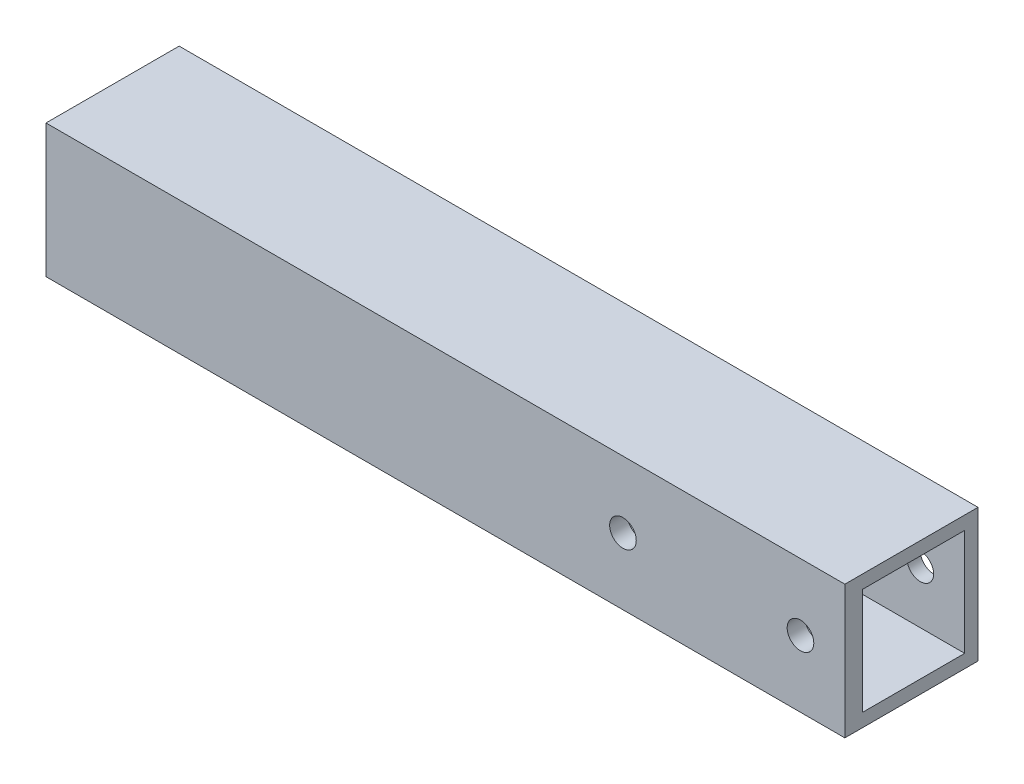
ISO-10303-21;
HEADER;
FILE_DESCRIPTION(('STEP AP214'),'2;1');
FILE_NAME('part.step','',(''),(''),'','','');
FILE_SCHEMA(('AUTOMOTIVE_DESIGN { 1 0 10303 214 1 1 1 1 }'));
ENDSEC;
DATA;
#1=APPLICATION_CONTEXT('core data for automotive mechanical design processes');
#2=APPLICATION_PROTOCOL_DEFINITION('international standard','automotive_design',2000,#1);
#3=PRODUCT_CONTEXT('',#1,'mechanical');
#4=PRODUCT('Part','Part','',(#3));
#5=PRODUCT_RELATED_PRODUCT_CATEGORY('part','',(#4));
#6=PRODUCT_DEFINITION_FORMATION('','',#4);
#7=PRODUCT_DEFINITION_CONTEXT('part definition',#1,'design');
#8=PRODUCT_DEFINITION('design','',#6,#7);
#9=PRODUCT_DEFINITION_SHAPE('','',#8);
#10=(LENGTH_UNIT() NAMED_UNIT(*) SI_UNIT(.MILLI.,.METRE.));
#11=(NAMED_UNIT(*) PLANE_ANGLE_UNIT() SI_UNIT($,.RADIAN.));
#12=(NAMED_UNIT(*) SI_UNIT($,.STERADIAN.) SOLID_ANGLE_UNIT());
#13=UNCERTAINTY_MEASURE_WITH_UNIT(LENGTH_MEASURE(1.E-05),#10,'distance_accuracy_value','');
#14=(GEOMETRIC_REPRESENTATION_CONTEXT(3) GLOBAL_UNCERTAINTY_ASSIGNED_CONTEXT((#13)) GLOBAL_UNIT_ASSIGNED_CONTEXT((#10,
#11,#12)) REPRESENTATION_CONTEXT('',''));
#15=CARTESIAN_POINT('',(0.,0.,0.));
#16=DIRECTION('',(0.,0.,1.));
#17=DIRECTION('',(1.,0.,0.));
#18=AXIS2_PLACEMENT_3D('',#15,#16,#17);
#19=CARTESIAN_POINT('',(90.,5.99999999999999,-3.50000000000001));
#20=DIRECTION('',(0.,-1.,0.));
#21=DIRECTION('',(0.,0.,-1.));
#22=AXIS2_PLACEMENT_3D('',#19,#20,#21);
#23=PLANE('',#22);
#24=DIRECTION('',(0.,0.,1.));
#25=VECTOR('',#24,1.);
#26=CARTESIAN_POINT('',(0.,5.99999999999999,-3.50000000000001));
#27=LINE('',#26,#25);
#28=CARTESIAN_POINT('',(0.,5.99999999999999,-6.));
#29=VERTEX_POINT('',#28);
#30=CARTESIAN_POINT('',(0.,5.99999999999999,5.50000000000001));
#31=VERTEX_POINT('',#30);
#32=EDGE_CURVE('E131',#29,#31,#27,.T.);
#33=ORIENTED_EDGE('',*,*,#32,.F.);
#34=DIRECTION('',(-1.,0.,0.));
#35=VECTOR('',#34,1.);
#36=CARTESIAN_POINT('',(90.,5.99999999999999,-6.));
#37=LINE('',#36,#35);
#38=CARTESIAN_POINT('',(90.,5.99999999999999,-6.));
#39=VERTEX_POINT('',#38);
#40=EDGE_CURVE('E12',#39,#29,#37,.T.);
#41=ORIENTED_EDGE('',*,*,#40,.F.);
#42=DIRECTION('',(0.,0.,1.));
#43=VECTOR('',#42,1.);
#44=CARTESIAN_POINT('',(90.,5.99999999999999,5.50000000000001));
#45=LINE('',#44,#43);
#46=CARTESIAN_POINT('',(90.,5.99999999999999,5.50000000000001));
#47=VERTEX_POINT('',#46);
#48=EDGE_CURVE('E160',#39,#47,#45,.T.);
#49=ORIENTED_EDGE('',*,*,#48,.T.);
#50=DIRECTION('',(-1.,0.,0.));
#51=VECTOR('',#50,1.);
#52=CARTESIAN_POINT('',(90.,5.99999999999999,5.50000000000001));
#53=LINE('',#52,#51);
#54=EDGE_CURVE('E209',#47,#31,#53,.T.);
#55=ORIENTED_EDGE('',*,*,#54,.T.);
#56=EDGE_LOOP('',(#33,#41,#49,#55));
#57=FACE_BOUND('',#56,.T.);
#58=ADVANCED_FACE('F79',(#57),#23,.T.);
#59=CARTESIAN_POINT('',(90.,-6.00000000000001,-6.));
#60=DIRECTION('',(0.,0.,1.));
#61=DIRECTION('',(0.,-1.,0.));
#62=AXIS2_PLACEMENT_3D('',#59,#60,#61);
#63=PLANE('',#62);
#64=CARTESIAN_POINT('',(85.,0.,-6.00000000000001));
#65=DIRECTION('',(0.,0.,1.));
#66=DIRECTION('',(0.,-1.,0.));
#67=AXIS2_PLACEMENT_3D('',#64,#65,#66);
#68=CIRCLE('',#67,1.5);
#69=CARTESIAN_POINT('',(86.5,0.,-6.00000000000001));
#70=VERTEX_POINT('',#69);
#71=EDGE_CURVE('E187',#70,#70,#68,.T.);
#72=ORIENTED_EDGE('',*,*,#71,.F.);
#73=EDGE_LOOP('',(#72));
#74=FACE_BOUND('',#73,.T.);
#75=CARTESIAN_POINT('',(65.,0.,-6.00000000000001));
#76=DIRECTION('',(0.,0.,1.));
#77=DIRECTION('',(0.,-1.,0.));
#78=AXIS2_PLACEMENT_3D('',#75,#76,#77);
#79=CIRCLE('',#78,1.5);
#80=CARTESIAN_POINT('',(66.5,0.,-6.00000000000001));
#81=VERTEX_POINT('',#80);
#82=EDGE_CURVE('E230',#81,#81,#79,.T.);
#83=ORIENTED_EDGE('',*,*,#82,.F.);
#84=EDGE_LOOP('',(#83));
#85=FACE_BOUND('',#84,.T.);
#86=DIRECTION('',(0.,1.,0.));
#87=VECTOR('',#86,1.);
#88=CARTESIAN_POINT('',(0.,-6.00000000000001,-6.));
#89=LINE('',#88,#87);
#90=CARTESIAN_POINT('',(0.,-6.00000000000001,-6.));
#91=VERTEX_POINT('',#90);
#92=EDGE_CURVE('E168',#91,#29,#89,.T.);
#93=ORIENTED_EDGE('',*,*,#92,.F.);
#94=DIRECTION('',(-1.,0.,0.));
#95=VECTOR('',#94,1.);
#96=CARTESIAN_POINT('',(90.,-6.00000000000001,-6.));
#97=LINE('',#96,#95);
#98=CARTESIAN_POINT('',(90.,-6.00000000000001,-6.));
#99=VERTEX_POINT('',#98);
#100=EDGE_CURVE('E90',#99,#91,#97,.T.);
#101=ORIENTED_EDGE('',*,*,#100,.F.);
#102=DIRECTION('',(0.,1.,0.));
#103=VECTOR('',#102,1.);
#104=CARTESIAN_POINT('',(90.,5.99999999999999,-6.));
#105=LINE('',#104,#103);
#106=EDGE_CURVE('E153',#99,#39,#105,.T.);
#107=ORIENTED_EDGE('',*,*,#106,.T.);
#108=ORIENTED_EDGE('',*,*,#40,.T.);
#109=EDGE_LOOP('',(#93,#101,#107,#108));
#110=FACE_BOUND('',#109,.T.);
#111=ADVANCED_FACE('F167',(#74,#85,#110),#63,.T.);
#112=CARTESIAN_POINT('',(90.,-6.00000000000001,5.50000000000001));
#113=DIRECTION('',(0.,1.,0.));
#114=DIRECTION('',(0.,0.,1.));
#115=AXIS2_PLACEMENT_3D('',#112,#113,#114);
#116=PLANE('',#115);
#117=DIRECTION('',(0.,0.,-1.));
#118=VECTOR('',#117,1.);
#119=CARTESIAN_POINT('',(0.,-6.00000000000001,5.50000000000001));
#120=LINE('',#119,#118);
#121=CARTESIAN_POINT('',(0.,-6.00000000000001,5.50000000000001));
#122=VERTEX_POINT('',#121);
#123=EDGE_CURVE('E203',#122,#91,#120,.T.);
#124=ORIENTED_EDGE('',*,*,#123,.F.);
#125=DIRECTION('',(-1.,0.,0.));
#126=VECTOR('',#125,1.);
#127=CARTESIAN_POINT('',(90.,-6.00000000000001,5.50000000000001));
#128=LINE('',#127,#126);
#129=CARTESIAN_POINT('',(90.,-6.00000000000001,5.50000000000001));
#130=VERTEX_POINT('',#129);
#131=EDGE_CURVE('E172',#130,#122,#128,.T.);
#132=ORIENTED_EDGE('',*,*,#131,.F.);
#133=DIRECTION('',(0.,0.,-1.));
#134=VECTOR('',#133,1.);
#135=CARTESIAN_POINT('',(90.,-6.,-4.00000000000001));
#136=LINE('',#135,#134);
#137=EDGE_CURVE('E157',#130,#99,#136,.T.);
#138=ORIENTED_EDGE('',*,*,#137,.T.);
#139=ORIENTED_EDGE('',*,*,#100,.T.);
#140=EDGE_LOOP('',(#124,#132,#138,#139));
#141=FACE_BOUND('',#140,.T.);
#142=ADVANCED_FACE('F174',(#141),#116,.T.);
#143=CARTESIAN_POINT('',(90.,7.49999999999999,7.50000000000001));
#144=DIRECTION('',(0.,-1.,0.));
#145=DIRECTION('',(0.,0.,-1.));
#146=AXIS2_PLACEMENT_3D('',#143,#144,#145);
#147=PLANE('',#146);
#148=DIRECTION('',(0.,0.,1.));
#149=VECTOR('',#148,1.);
#150=CARTESIAN_POINT('',(0.,7.49999999999999,7.50000000000001));
#151=LINE('',#150,#149);
#152=CARTESIAN_POINT('',(0.,7.49999999999999,-7.5));
#153=VERTEX_POINT('',#152);
#154=CARTESIAN_POINT('',(0.,7.49999999999999,7.50000000000001));
#155=VERTEX_POINT('',#154);
#156=EDGE_CURVE('E182',#153,#155,#151,.T.);
#157=ORIENTED_EDGE('',*,*,#156,.T.);
#158=DIRECTION('',(-1.,0.,0.));
#159=VECTOR('',#158,1.);
#160=CARTESIAN_POINT('',(90.,7.49999999999999,7.50000000000001));
#161=LINE('',#160,#159);
#162=CARTESIAN_POINT('',(90.,7.49999999999999,7.50000000000001));
#163=VERTEX_POINT('',#162);
#164=EDGE_CURVE('E222',#163,#155,#161,.T.);
#165=ORIENTED_EDGE('',*,*,#164,.F.);
#166=DIRECTION('',(0.,0.,1.));
#167=VECTOR('',#166,1.);
#168=CARTESIAN_POINT('',(90.,7.49999999999999,-6.));
#169=LINE('',#168,#167);
#170=CARTESIAN_POINT('',(90.,7.49999999999999,-7.5));
#171=VERTEX_POINT('',#170);
#172=EDGE_CURVE('E140',#171,#163,#169,.T.);
#173=ORIENTED_EDGE('',*,*,#172,.F.);
#174=DIRECTION('',(-1.,0.,0.));
#175=VECTOR('',#174,1.);
#176=CARTESIAN_POINT('',(90.,7.49999999999999,-7.5));
#177=LINE('',#176,#175);
#178=EDGE_CURVE('E212',#171,#153,#177,.T.);
#179=ORIENTED_EDGE('',*,*,#178,.T.);
#180=EDGE_LOOP('',(#157,#165,#173,#179));
#181=FACE_BOUND('',#180,.T.);
#182=ADVANCED_FACE('F81',(#181),#147,.F.);
#183=CARTESIAN_POINT('',(90.,-6.00000000000001,7.50000000000001));
#184=DIRECTION('',(0.,0.,-1.));
#185=DIRECTION('',(-1.,0.,0.));
#186=AXIS2_PLACEMENT_3D('',#183,#184,#185);
#187=PLANE('',#186);
#188=CARTESIAN_POINT('',(85.,0.,7.50000000000001));
#189=DIRECTION('',(0.,0.,1.));
#190=DIRECTION('',(1.,0.,0.));
#191=AXIS2_PLACEMENT_3D('',#188,#189,#190);
#192=CIRCLE('',#191,1.5);
#193=CARTESIAN_POINT('',(86.5,0.,7.50000000000001));
#194=VERTEX_POINT('',#193);
#195=EDGE_CURVE('E239',#194,#194,#192,.T.);
#196=ORIENTED_EDGE('',*,*,#195,.F.);
#197=EDGE_LOOP('',(#196));
#198=FACE_BOUND('',#197,.T.);
#199=CARTESIAN_POINT('',(65.,0.,7.50000000000001));
#200=DIRECTION('',(0.,0.,1.));
#201=DIRECTION('',(1.,0.,0.));
#202=AXIS2_PLACEMENT_3D('',#199,#200,#201);
#203=CIRCLE('',#202,1.5);
#204=CARTESIAN_POINT('',(66.5,0.,7.50000000000001));
#205=VERTEX_POINT('',#204);
#206=EDGE_CURVE('E251',#205,#205,#203,.T.);
#207=ORIENTED_EDGE('',*,*,#206,.F.);
#208=EDGE_LOOP('',(#207));
#209=FACE_BOUND('',#208,.T.);
#210=DIRECTION('',(0.,-1.,0.));
#211=VECTOR('',#210,1.);
#212=CARTESIAN_POINT('',(0.,-6.00000000000001,7.50000000000001));
#213=LINE('',#212,#211);
#214=CARTESIAN_POINT('',(0.,-7.50000000000001,7.50000000000001));
#215=VERTEX_POINT('',#214);
#216=EDGE_CURVE('E186',#155,#215,#213,.T.);
#217=ORIENTED_EDGE('',*,*,#216,.T.);
#218=DIRECTION('',(-1.,0.,0.));
#219=VECTOR('',#218,1.);
#220=CARTESIAN_POINT('',(90.,-7.50000000000001,7.50000000000001));
#221=LINE('',#220,#219);
#222=CARTESIAN_POINT('',(90.,-7.50000000000001,7.50000000000001));
#223=VERTEX_POINT('',#222);
#224=EDGE_CURVE('E218',#223,#215,#221,.T.);
#225=ORIENTED_EDGE('',*,*,#224,.F.);
#226=DIRECTION('',(0.,-1.,0.));
#227=VECTOR('',#226,1.);
#228=CARTESIAN_POINT('',(90.,6.00000000000001,7.50000000000001));
#229=LINE('',#228,#227);
#230=EDGE_CURVE('E262',#163,#223,#229,.T.);
#231=ORIENTED_EDGE('',*,*,#230,.F.);
#232=ORIENTED_EDGE('',*,*,#164,.T.);
#233=EDGE_LOOP('',(#217,#225,#231,#232));
#234=FACE_BOUND('',#233,.T.);
#235=ADVANCED_FACE('F300',(#198,#209,#234),#187,.F.);
#236=CARTESIAN_POINT('',(90.,-7.5,-7.5));
#237=DIRECTION('',(0.,1.,0.));
#238=DIRECTION('',(0.,0.,1.));
#239=AXIS2_PLACEMENT_3D('',#236,#237,#238);
#240=PLANE('',#239);
#241=DIRECTION('',(0.,0.,-1.));
#242=VECTOR('',#241,1.);
#243=CARTESIAN_POINT('',(0.,-7.5,-7.5));
#244=LINE('',#243,#242);
#245=CARTESIAN_POINT('',(0.,-7.5,-7.5));
#246=VERTEX_POINT('',#245);
#247=EDGE_CURVE('E191',#215,#246,#244,.T.);
#248=ORIENTED_EDGE('',*,*,#247,.T.);
#249=DIRECTION('',(-1.,0.,0.));
#250=VECTOR('',#249,1.);
#251=CARTESIAN_POINT('',(90.,-7.5,-7.5));
#252=LINE('',#251,#250);
#253=CARTESIAN_POINT('',(90.,-7.5,-7.5));
#254=VERTEX_POINT('',#253);
#255=EDGE_CURVE('E178',#254,#246,#252,.T.);
#256=ORIENTED_EDGE('',*,*,#255,.F.);
#257=DIRECTION('',(0.,0.,-1.));
#258=VECTOR('',#257,1.);
#259=CARTESIAN_POINT('',(90.,-7.50000000000001,7.50000000000001));
#260=LINE('',#259,#258);
#261=EDGE_CURVE('E265',#223,#254,#260,.T.);
#262=ORIENTED_EDGE('',*,*,#261,.F.);
#263=ORIENTED_EDGE('',*,*,#224,.T.);
#264=EDGE_LOOP('',(#248,#256,#262,#263));
#265=FACE_BOUND('',#264,.T.);
#266=ADVANCED_FACE('F298',(#265),#240,.F.);
#267=CARTESIAN_POINT('',(90.,6.,-7.50000000000001));
#268=DIRECTION('',(0.,0.,1.));
#269=DIRECTION('',(0.,-1.,0.));
#270=AXIS2_PLACEMENT_3D('',#267,#268,#269);
#271=PLANE('',#270);
#272=CARTESIAN_POINT('',(85.,0.,-7.50000000000001));
#273=DIRECTION('',(0.,0.,1.));
#274=DIRECTION('',(1.,0.,0.));
#275=AXIS2_PLACEMENT_3D('',#272,#273,#274);
#276=CIRCLE('',#275,1.5);
#277=CARTESIAN_POINT('',(86.5,0.,-7.50000000000001));
#278=VERTEX_POINT('',#277);
#279=EDGE_CURVE('E231',#278,#278,#276,.T.);
#280=ORIENTED_EDGE('',*,*,#279,.T.);
#281=EDGE_LOOP('',(#280));
#282=FACE_BOUND('',#281,.T.);
#283=CARTESIAN_POINT('',(65.,0.,-7.50000000000001));
#284=DIRECTION('',(0.,0.,1.));
#285=DIRECTION('',(1.,0.,0.));
#286=AXIS2_PLACEMENT_3D('',#283,#284,#285);
#287=CIRCLE('',#286,1.5);
#288=CARTESIAN_POINT('',(66.5,0.,-7.50000000000001));
#289=VERTEX_POINT('',#288);
#290=EDGE_CURVE('E245',#289,#289,#287,.T.);
#291=ORIENTED_EDGE('',*,*,#290,.T.);
#292=EDGE_LOOP('',(#291));
#293=FACE_BOUND('',#292,.T.);
#294=DIRECTION('',(0.,1.,0.));
#295=VECTOR('',#294,1.);
#296=CARTESIAN_POINT('',(0.,6.,-7.50000000000001));
#297=LINE('',#296,#295);
#298=EDGE_CURVE('E195',#246,#153,#297,.T.);
#299=ORIENTED_EDGE('',*,*,#298,.T.);
#300=ORIENTED_EDGE('',*,*,#178,.F.);
#301=DIRECTION('',(0.,1.,0.));
#302=VECTOR('',#301,1.);
#303=CARTESIAN_POINT('',(90.,7.49999999999999,-7.5));
#304=LINE('',#303,#302);
#305=EDGE_CURVE('E208',#254,#171,#304,.T.);
#306=ORIENTED_EDGE('',*,*,#305,.F.);
#307=ORIENTED_EDGE('',*,*,#255,.T.);
#308=EDGE_LOOP('',(#299,#300,#306,#307));
#309=FACE_BOUND('',#308,.T.);
#310=ADVANCED_FACE('F295',(#282,#293,#309),#271,.F.);
#311=CARTESIAN_POINT('',(90.,3.5,5.50000000000001));
#312=DIRECTION('',(0.,0.,-1.));
#313=DIRECTION('',(0.,1.,0.));
#314=AXIS2_PLACEMENT_3D('',#311,#312,#313);
#315=PLANE('',#314);
#316=CARTESIAN_POINT('',(85.,0.,5.5));
#317=DIRECTION('',(0.,0.,-1.));
#318=DIRECTION('',(0.,1.,0.));
#319=AXIS2_PLACEMENT_3D('',#316,#317,#318);
#320=CIRCLE('',#319,1.5);
#321=CARTESIAN_POINT('',(86.5,0.,5.5));
#322=VERTEX_POINT('',#321);
#323=EDGE_CURVE('E83',#322,#322,#320,.T.);
#324=ORIENTED_EDGE('',*,*,#323,.F.);
#325=EDGE_LOOP('',(#324));
#326=FACE_BOUND('',#325,.T.);
#327=CARTESIAN_POINT('',(65.,0.,5.5));
#328=DIRECTION('',(0.,0.,-1.));
#329=DIRECTION('',(0.,1.,0.));
#330=AXIS2_PLACEMENT_3D('',#327,#328,#329);
#331=CIRCLE('',#330,1.5);
#332=CARTESIAN_POINT('',(66.5,0.,5.5));
#333=VERTEX_POINT('',#332);
#334=EDGE_CURVE('E227',#333,#333,#331,.T.);
#335=ORIENTED_EDGE('',*,*,#334,.F.);
#336=EDGE_LOOP('',(#335));
#337=FACE_BOUND('',#336,.T.);
#338=DIRECTION('',(0.,-1.,0.));
#339=VECTOR('',#338,1.);
#340=CARTESIAN_POINT('',(0.,3.5,5.50000000000001));
#341=LINE('',#340,#339);
#342=EDGE_CURVE('E127',#31,#122,#341,.T.);
#343=ORIENTED_EDGE('',*,*,#342,.F.);
#344=ORIENTED_EDGE('',*,*,#54,.F.);
#345=DIRECTION('',(0.,-1.,0.));
#346=VECTOR('',#345,1.);
#347=CARTESIAN_POINT('',(90.,-3.5,5.50000000000001));
#348=LINE('',#347,#346);
#349=EDGE_CURVE('E99',#47,#130,#348,.T.);
#350=ORIENTED_EDGE('',*,*,#349,.T.);
#351=ORIENTED_EDGE('',*,*,#131,.T.);
#352=EDGE_LOOP('',(#343,#344,#350,#351));
#353=FACE_BOUND('',#352,.T.);
#354=ADVANCED_FACE('F270',(#326,#337,#353),#315,.T.);
#355=CARTESIAN_POINT('',(90.,0.,0.));
#356=DIRECTION('',(-1.,0.,0.));
#357=DIRECTION('',(0.,0.,1.));
#358=AXIS2_PLACEMENT_3D('',#355,#356,#357);
#359=PLANE('',#358);
#360=ORIENTED_EDGE('',*,*,#305,.T.);
#361=ORIENTED_EDGE('',*,*,#172,.T.);
#362=ORIENTED_EDGE('',*,*,#230,.T.);
#363=ORIENTED_EDGE('',*,*,#261,.T.);
#364=EDGE_LOOP('',(#360,#361,#362,#363));
#365=FACE_BOUND('',#364,.T.);
#366=ORIENTED_EDGE('',*,*,#48,.F.);
#367=ORIENTED_EDGE('',*,*,#106,.F.);
#368=ORIENTED_EDGE('',*,*,#137,.F.);
#369=ORIENTED_EDGE('',*,*,#349,.F.);
#370=EDGE_LOOP('',(#366,#367,#368,#369));
#371=FACE_BOUND('',#370,.T.);
#372=ADVANCED_FACE('F155',(#365,#371),#359,.F.);
#373=CARTESIAN_POINT('',(0.,0.,0.));
#374=DIRECTION('',(-1.,0.,0.));
#375=DIRECTION('',(0.,0.,1.));
#376=AXIS2_PLACEMENT_3D('',#373,#374,#375);
#377=PLANE('',#376);
#378=ORIENTED_EDGE('',*,*,#156,.F.);
#379=ORIENTED_EDGE('',*,*,#298,.F.);
#380=ORIENTED_EDGE('',*,*,#247,.F.);
#381=ORIENTED_EDGE('',*,*,#216,.F.);
#382=EDGE_LOOP('',(#378,#379,#380,#381));
#383=FACE_BOUND('',#382,.T.);
#384=ORIENTED_EDGE('',*,*,#32,.T.);
#385=ORIENTED_EDGE('',*,*,#342,.T.);
#386=ORIENTED_EDGE('',*,*,#123,.T.);
#387=ORIENTED_EDGE('',*,*,#92,.T.);
#388=EDGE_LOOP('',(#384,#385,#386,#387));
#389=FACE_BOUND('',#388,.T.);
#390=ADVANCED_FACE('F271',(#383,#389),#377,.T.);
#391=CARTESIAN_POINT('',(65.,0.,-7.50000000000001));
#392=DIRECTION('',(0.,0.,1.));
#393=DIRECTION('',(1.,0.,0.));
#394=AXIS2_PLACEMENT_3D('',#391,#392,#393);
#395=CYLINDRICAL_SURFACE('',#394,1.5);
#396=CARTESIAN_POINT('',(66.5,0.,5.5));
#397=CARTESIAN_POINT('',(66.5,0.,5.52083333333334));
#398=CARTESIAN_POINT('',(66.5,0.,5.54166666666667));
#399=CARTESIAN_POINT('',(66.5,0.,5.58333333333334));
#400=CARTESIAN_POINT('',(66.5,0.,5.60416666666667));
#401=CARTESIAN_POINT('',(66.5,0.,5.64583333333334));
#402=CARTESIAN_POINT('',(66.5,0.,5.66666666666667));
#403=CARTESIAN_POINT('',(66.5,0.,5.70833333333334));
#404=CARTESIAN_POINT('',(66.5,0.,5.72916666666667));
#405=CARTESIAN_POINT('',(66.5,0.,5.77083333333334));
#406=CARTESIAN_POINT('',(66.5,0.,5.79166666666667));
#407=CARTESIAN_POINT('',(66.5,0.,5.83333333333334));
#408=CARTESIAN_POINT('',(66.5,0.,5.85416666666667));
#409=CARTESIAN_POINT('',(66.5,0.,5.89583333333334));
#410=CARTESIAN_POINT('',(66.5,0.,5.91666666666667));
#411=CARTESIAN_POINT('',(66.5,0.,5.95833333333334));
#412=CARTESIAN_POINT('',(66.5,0.,5.97916666666667));
#413=CARTESIAN_POINT('',(66.5,0.,6.02083333333334));
#414=CARTESIAN_POINT('',(66.5,0.,6.04166666666667));
#415=CARTESIAN_POINT('',(66.5,0.,6.08333333333334));
#416=CARTESIAN_POINT('',(66.5,0.,6.10416666666667));
#417=CARTESIAN_POINT('',(66.5,0.,6.14583333333334));
#418=CARTESIAN_POINT('',(66.5,0.,6.16666666666667));
#419=CARTESIAN_POINT('',(66.5,0.,6.20833333333334));
#420=CARTESIAN_POINT('',(66.5,0.,6.22916666666667));
#421=CARTESIAN_POINT('',(66.5,0.,6.27083333333334));
#422=CARTESIAN_POINT('',(66.5,0.,6.29166666666667));
#423=CARTESIAN_POINT('',(66.5,0.,6.33333333333334));
#424=CARTESIAN_POINT('',(66.5,0.,6.35416666666667));
#425=CARTESIAN_POINT('',(66.5,0.,6.39583333333334));
#426=CARTESIAN_POINT('',(66.5,0.,6.41666666666667));
#427=CARTESIAN_POINT('',(66.5,0.,6.45833333333334));
#428=CARTESIAN_POINT('',(66.5,0.,6.47916666666667));
#429=CARTESIAN_POINT('',(66.5,0.,6.52083333333334));
#430=CARTESIAN_POINT('',(66.5,0.,6.54166666666667));
#431=CARTESIAN_POINT('',(66.5,0.,6.58333333333334));
#432=CARTESIAN_POINT('',(66.5,0.,6.60416666666667));
#433=CARTESIAN_POINT('',(66.5,0.,6.64583333333334));
#434=CARTESIAN_POINT('',(66.5,0.,6.66666666666667));
#435=CARTESIAN_POINT('',(66.5,0.,6.70833333333334));
#436=CARTESIAN_POINT('',(66.5,0.,6.72916666666667));
#437=CARTESIAN_POINT('',(66.5,0.,6.77083333333334));
#438=CARTESIAN_POINT('',(66.5,0.,6.79166666666667));
#439=CARTESIAN_POINT('',(66.5,0.,6.83333333333334));
#440=CARTESIAN_POINT('',(66.5,0.,6.85416666666667));
#441=CARTESIAN_POINT('',(66.5,0.,6.89583333333334));
#442=CARTESIAN_POINT('',(66.5,0.,6.91666666666667));
#443=CARTESIAN_POINT('',(66.5,0.,6.95833333333334));
#444=CARTESIAN_POINT('',(66.5,0.,6.97916666666667));
#445=CARTESIAN_POINT('',(66.5,0.,7.02083333333334));
#446=CARTESIAN_POINT('',(66.5,0.,7.04166666666667));
#447=CARTESIAN_POINT('',(66.5,0.,7.08333333333334));
#448=CARTESIAN_POINT('',(66.5,0.,7.10416666666667));
#449=CARTESIAN_POINT('',(66.5,0.,7.14583333333334));
#450=CARTESIAN_POINT('',(66.5,0.,7.16666666666667));
#451=CARTESIAN_POINT('',(66.5,0.,7.20833333333334));
#452=CARTESIAN_POINT('',(66.5,0.,7.22916666666667));
#453=CARTESIAN_POINT('',(66.5,0.,7.27083333333334));
#454=CARTESIAN_POINT('',(66.5,0.,7.29166666666667));
#455=CARTESIAN_POINT('',(66.5,0.,7.33333333333334));
#456=CARTESIAN_POINT('',(66.5,0.,7.35416666666667));
#457=CARTESIAN_POINT('',(66.5,0.,7.39583333333334));
#458=CARTESIAN_POINT('',(66.5,0.,7.41666666666667));
#459=CARTESIAN_POINT('',(66.5,0.,7.45833333333334));
#460=CARTESIAN_POINT('',(66.5,0.,7.47916666666667));
#461=CARTESIAN_POINT('',(66.5,0.,7.50000000000001));
#462=B_SPLINE_CURVE_WITH_KNOTS('',3,(#396,#397,#398,#399,#400,#401,#402,#403,#404,#405,#406,
#407,#408,#409,#410,#411,#412,#413,#414,#415,#416,#417,#418,#419,#420,#421,#422,#423,#424,#425,
#426,#427,#428,#429,#430,#431,#432,#433,#434,#435,#436,#437,#438,#439,#440,#441,#442,#443,#444,
#445,#446,#447,#448,#449,#450,#451,#452,#453,#454,#455,#456,#457,#458,#459,#460,#461),
.UNSPECIFIED.,.F.,.F.,(4,2,2,2,2,2,2,2,2,2,2,2,2,2,2,2,2,2,2,2,2,2,2,2,2,2,2,2,2,2,2,2,4),(0.,
0.0625000000000001,0.125,0.1875,0.25,0.3125,0.375,0.4375,0.5,0.5625,0.625000000000001,
0.687500000000001,0.750000000000001,0.812500000000001,0.875000000000001,0.937500000000001,1.,
1.0625,1.125,1.1875,1.25,1.3125,1.375,1.4375,1.5,1.5625,1.625,1.6875,1.75,1.8125,1.875,1.9375,
2.),.UNSPECIFIED.);
#463=EDGE_CURVE('BSEAM273',#333,#205,#462,.T.);
#464=ORIENTED_EDGE('',*,*,#334,.T.);
#465=ORIENTED_EDGE('',*,*,#206,.T.);
#466=ORIENTED_EDGE('',*,*,#463,.T.);
#467=ORIENTED_EDGE('',*,*,#463,.F.);
#468=EDGE_LOOP('',(#464,#466,#465,#467));
#469=FACE_BOUND('',#468,.T.);
#470=ADVANCED_FACE('F273',(#469),#395,.F.);
#471=CARTESIAN_POINT('',(85.,0.,-7.50000000000001));
#472=DIRECTION('',(0.,0.,1.));
#473=DIRECTION('',(1.,0.,0.));
#474=AXIS2_PLACEMENT_3D('',#471,#472,#473);
#475=CYLINDRICAL_SURFACE('',#474,1.5);
#476=CARTESIAN_POINT('',(86.5,0.,5.5));
#477=CARTESIAN_POINT('',(86.5,0.,5.52083333333334));
#478=CARTESIAN_POINT('',(86.5,0.,5.54166666666667));
#479=CARTESIAN_POINT('',(86.5,0.,5.58333333333334));
#480=CARTESIAN_POINT('',(86.5,0.,5.60416666666667));
#481=CARTESIAN_POINT('',(86.5,0.,5.64583333333334));
#482=CARTESIAN_POINT('',(86.5,0.,5.66666666666667));
#483=CARTESIAN_POINT('',(86.5,0.,5.70833333333334));
#484=CARTESIAN_POINT('',(86.5,0.,5.72916666666667));
#485=CARTESIAN_POINT('',(86.5,0.,5.77083333333334));
#486=CARTESIAN_POINT('',(86.5,0.,5.79166666666667));
#487=CARTESIAN_POINT('',(86.5,0.,5.83333333333334));
#488=CARTESIAN_POINT('',(86.5,0.,5.85416666666667));
#489=CARTESIAN_POINT('',(86.5,0.,5.89583333333334));
#490=CARTESIAN_POINT('',(86.5,0.,5.91666666666667));
#491=CARTESIAN_POINT('',(86.5,0.,5.95833333333334));
#492=CARTESIAN_POINT('',(86.5,0.,5.97916666666667));
#493=CARTESIAN_POINT('',(86.5,0.,6.02083333333334));
#494=CARTESIAN_POINT('',(86.5,0.,6.04166666666667));
#495=CARTESIAN_POINT('',(86.5,0.,6.08333333333334));
#496=CARTESIAN_POINT('',(86.5,0.,6.10416666666667));
#497=CARTESIAN_POINT('',(86.5,0.,6.14583333333334));
#498=CARTESIAN_POINT('',(86.5,0.,6.16666666666667));
#499=CARTESIAN_POINT('',(86.5,0.,6.20833333333334));
#500=CARTESIAN_POINT('',(86.5,0.,6.22916666666667));
#501=CARTESIAN_POINT('',(86.5,0.,6.27083333333334));
#502=CARTESIAN_POINT('',(86.5,0.,6.29166666666667));
#503=CARTESIAN_POINT('',(86.5,0.,6.33333333333334));
#504=CARTESIAN_POINT('',(86.5,0.,6.35416666666667));
#505=CARTESIAN_POINT('',(86.5,0.,6.39583333333334));
#506=CARTESIAN_POINT('',(86.5,0.,6.41666666666667));
#507=CARTESIAN_POINT('',(86.5,0.,6.45833333333334));
#508=CARTESIAN_POINT('',(86.5,0.,6.47916666666667));
#509=CARTESIAN_POINT('',(86.5,0.,6.52083333333334));
#510=CARTESIAN_POINT('',(86.5,0.,6.54166666666667));
#511=CARTESIAN_POINT('',(86.5,0.,6.58333333333334));
#512=CARTESIAN_POINT('',(86.5,0.,6.60416666666667));
#513=CARTESIAN_POINT('',(86.5,0.,6.64583333333334));
#514=CARTESIAN_POINT('',(86.5,0.,6.66666666666667));
#515=CARTESIAN_POINT('',(86.5,0.,6.70833333333334));
#516=CARTESIAN_POINT('',(86.5,0.,6.72916666666667));
#517=CARTESIAN_POINT('',(86.5,0.,6.77083333333334));
#518=CARTESIAN_POINT('',(86.5,0.,6.79166666666667));
#519=CARTESIAN_POINT('',(86.5,0.,6.83333333333334));
#520=CARTESIAN_POINT('',(86.5,0.,6.85416666666667));
#521=CARTESIAN_POINT('',(86.5,0.,6.89583333333334));
#522=CARTESIAN_POINT('',(86.5,0.,6.91666666666667));
#523=CARTESIAN_POINT('',(86.5,0.,6.95833333333334));
#524=CARTESIAN_POINT('',(86.5,0.,6.97916666666667));
#525=CARTESIAN_POINT('',(86.5,0.,7.02083333333334));
#526=CARTESIAN_POINT('',(86.5,0.,7.04166666666667));
#527=CARTESIAN_POINT('',(86.5,0.,7.08333333333334));
#528=CARTESIAN_POINT('',(86.5,0.,7.10416666666667));
#529=CARTESIAN_POINT('',(86.5,0.,7.14583333333334));
#530=CARTESIAN_POINT('',(86.5,0.,7.16666666666667));
#531=CARTESIAN_POINT('',(86.5,0.,7.20833333333334));
#532=CARTESIAN_POINT('',(86.5,0.,7.22916666666667));
#533=CARTESIAN_POINT('',(86.5,0.,7.27083333333334));
#534=CARTESIAN_POINT('',(86.5,0.,7.29166666666667));
#535=CARTESIAN_POINT('',(86.5,0.,7.33333333333334));
#536=CARTESIAN_POINT('',(86.5,0.,7.35416666666667));
#537=CARTESIAN_POINT('',(86.5,0.,7.39583333333334));
#538=CARTESIAN_POINT('',(86.5,0.,7.41666666666667));
#539=CARTESIAN_POINT('',(86.5,0.,7.45833333333334));
#540=CARTESIAN_POINT('',(86.5,0.,7.47916666666667));
#541=CARTESIAN_POINT('',(86.5,0.,7.50000000000001));
#542=B_SPLINE_CURVE_WITH_KNOTS('',3,(#476,#477,#478,#479,#480,#481,#482,#483,#484,#485,#486,
#487,#488,#489,#490,#491,#492,#493,#494,#495,#496,#497,#498,#499,#500,#501,#502,#503,#504,#505,
#506,#507,#508,#509,#510,#511,#512,#513,#514,#515,#516,#517,#518,#519,#520,#521,#522,#523,#524,
#525,#526,#527,#528,#529,#530,#531,#532,#533,#534,#535,#536,#537,#538,#539,#540,#541),
.UNSPECIFIED.,.F.,.F.,(4,2,2,2,2,2,2,2,2,2,2,2,2,2,2,2,2,2,2,2,2,2,2,2,2,2,2,2,2,2,2,2,4),(0.,
0.0625000000000001,0.125,0.1875,0.25,0.3125,0.375,0.4375,0.5,0.5625,0.625000000000001,
0.687500000000001,0.750000000000001,0.812500000000001,0.875000000000001,0.937500000000001,1.,
1.0625,1.125,1.1875,1.25,1.3125,1.375,1.4375,1.5,1.5625,1.625,1.6875,1.75,1.8125,1.875,1.9375,
2.),.UNSPECIFIED.);
#543=EDGE_CURVE('BSEAM280',#322,#194,#542,.T.);
#544=ORIENTED_EDGE('',*,*,#323,.T.);
#545=ORIENTED_EDGE('',*,*,#195,.T.);
#546=ORIENTED_EDGE('',*,*,#543,.T.);
#547=ORIENTED_EDGE('',*,*,#543,.F.);
#548=EDGE_LOOP('',(#544,#546,#545,#547));
#549=FACE_BOUND('',#548,.T.);
#550=ADVANCED_FACE('F280',(#549),#475,.F.);
#551=CARTESIAN_POINT('',(66.5,0.,-6.00000000000001));
#552=CARTESIAN_POINT('',(66.5,0.,-6.01562500000001));
#553=CARTESIAN_POINT('',(66.5,0.,-6.03125000000001));
#554=CARTESIAN_POINT('',(66.5,0.,-6.06250000000001));
#555=CARTESIAN_POINT('',(66.5,0.,-6.07812500000001));
#556=CARTESIAN_POINT('',(66.5,0.,-6.10937500000001));
#557=CARTESIAN_POINT('',(66.5,0.,-6.12500000000001));
#558=CARTESIAN_POINT('',(66.5,0.,-6.15625000000001));
#559=CARTESIAN_POINT('',(66.5,0.,-6.17187500000001));
#560=CARTESIAN_POINT('',(66.5,0.,-6.20312500000001));
#561=CARTESIAN_POINT('',(66.5,0.,-6.21875000000001));
#562=CARTESIAN_POINT('',(66.5,0.,-6.25000000000001));
#563=CARTESIAN_POINT('',(66.5,0.,-6.26562500000001));
#564=CARTESIAN_POINT('',(66.5,0.,-6.29687500000001));
#565=CARTESIAN_POINT('',(66.5,0.,-6.31250000000001));
#566=CARTESIAN_POINT('',(66.5,0.,-6.34375000000001));
#567=CARTESIAN_POINT('',(66.5,0.,-6.35937500000001));
#568=CARTESIAN_POINT('',(66.5,0.,-6.39062500000001));
#569=CARTESIAN_POINT('',(66.5,0.,-6.40625000000001));
#570=CARTESIAN_POINT('',(66.5,0.,-6.43750000000001));
#571=CARTESIAN_POINT('',(66.5,0.,-6.45312500000001));
#572=CARTESIAN_POINT('',(66.5,0.,-6.48437500000001));
#573=CARTESIAN_POINT('',(66.5,0.,-6.50000000000001));
#574=CARTESIAN_POINT('',(66.5,0.,-6.53125000000001));
#575=CARTESIAN_POINT('',(66.5,0.,-6.54687500000001));
#576=CARTESIAN_POINT('',(66.5,0.,-6.57812500000001));
#577=CARTESIAN_POINT('',(66.5,0.,-6.59375000000001));
#578=CARTESIAN_POINT('',(66.5,0.,-6.62500000000001));
#579=CARTESIAN_POINT('',(66.5,0.,-6.64062500000001));
#580=CARTESIAN_POINT('',(66.5,0.,-6.67187500000001));
#581=CARTESIAN_POINT('',(66.5,0.,-6.68750000000001));
#582=CARTESIAN_POINT('',(66.5,0.,-6.71875000000001));
#583=CARTESIAN_POINT('',(66.5,0.,-6.73437500000001));
#584=CARTESIAN_POINT('',(66.5,0.,-6.76562500000001));
#585=CARTESIAN_POINT('',(66.5,0.,-6.78125000000001));
#586=CARTESIAN_POINT('',(66.5,0.,-6.81250000000001));
#587=CARTESIAN_POINT('',(66.5,0.,-6.82812500000001));
#588=CARTESIAN_POINT('',(66.5,0.,-6.85937500000001));
#589=CARTESIAN_POINT('',(66.5,0.,-6.87500000000001));
#590=CARTESIAN_POINT('',(66.5,0.,-6.90625000000001));
#591=CARTESIAN_POINT('',(66.5,0.,-6.92187500000001));
#592=CARTESIAN_POINT('',(66.5,0.,-6.95312500000001));
#593=CARTESIAN_POINT('',(66.5,0.,-6.96875000000001));
#594=CARTESIAN_POINT('',(66.5,0.,-7.00000000000001));
#595=CARTESIAN_POINT('',(66.5,0.,-7.01562500000001));
#596=CARTESIAN_POINT('',(66.5,0.,-7.04687500000001));
#597=CARTESIAN_POINT('',(66.5,0.,-7.06250000000001));
#598=CARTESIAN_POINT('',(66.5,0.,-7.09375000000001));
#599=CARTESIAN_POINT('',(66.5,0.,-7.10937500000001));
#600=CARTESIAN_POINT('',(66.5,0.,-7.14062500000001));
#601=CARTESIAN_POINT('',(66.5,0.,-7.15625000000001));
#602=CARTESIAN_POINT('',(66.5,0.,-7.18750000000001));
#603=CARTESIAN_POINT('',(66.5,0.,-7.20312500000001));
#604=CARTESIAN_POINT('',(66.5,0.,-7.23437500000001));
#605=CARTESIAN_POINT('',(66.5,0.,-7.25000000000001));
#606=CARTESIAN_POINT('',(66.5,0.,-7.28125000000001));
#607=CARTESIAN_POINT('',(66.5,0.,-7.29687500000001));
#608=CARTESIAN_POINT('',(66.5,0.,-7.32812500000001));
#609=CARTESIAN_POINT('',(66.5,0.,-7.34375000000001));
#610=CARTESIAN_POINT('',(66.5,0.,-7.37500000000001));
#611=CARTESIAN_POINT('',(66.5,0.,-7.39062500000001));
#612=CARTESIAN_POINT('',(66.5,0.,-7.42187500000001));
#613=CARTESIAN_POINT('',(66.5,0.,-7.43750000000001));
#614=CARTESIAN_POINT('',(66.5,0.,-7.46875000000001));
#615=CARTESIAN_POINT('',(66.5,0.,-7.48437500000001));
#616=CARTESIAN_POINT('',(66.5,0.,-7.50000000000001));
#617=B_SPLINE_CURVE_WITH_KNOTS('',3,(#551,#552,#553,#554,#555,#556,#557,#558,#559,#560,#561,
#562,#563,#564,#565,#566,#567,#568,#569,#570,#571,#572,#573,#574,#575,#576,#577,#578,#579,#580,
#581,#582,#583,#584,#585,#586,#587,#588,#589,#590,#591,#592,#593,#594,#595,#596,#597,#598,#599,
#600,#601,#602,#603,#604,#605,#606,#607,#608,#609,#610,#611,#612,#613,#614,#615,#616),
.UNSPECIFIED.,.F.,.F.,(4,2,2,2,2,2,2,2,2,2,2,2,2,2,2,2,2,2,2,2,2,2,2,2,2,2,2,2,2,2,2,2,4),(0.,
0.046875,0.0937500000000001,0.140625,0.1875,0.234375,0.28125,0.328125,0.375,0.421875,0.46875,
0.515625,0.5625,0.609375000000001,0.656250000000001,0.703125000000001,0.750000000000001,
0.796875000000001,0.843750000000001,0.890625000000001,0.937500000000001,0.984375000000001,
1.03125,1.078125,1.125,1.171875,1.21875,1.265625,1.3125,1.359375,1.40625,1.453125,1.5),.UNSPECIFIED.);
#618=EDGE_CURVE('BSEAM282',#81,#289,#617,.T.);
#619=ORIENTED_EDGE('',*,*,#82,.T.);
#620=ORIENTED_EDGE('',*,*,#290,.F.);
#621=ORIENTED_EDGE('',*,*,#618,.T.);
#622=ORIENTED_EDGE('',*,*,#618,.F.);
#623=EDGE_LOOP('',(#619,#621,#620,#622));
#624=FACE_BOUND('',#623,.T.);
#625=ADVANCED_FACE('F282',(#624),#395,.F.);
#626=CARTESIAN_POINT('',(86.5,0.,-6.00000000000001));
#627=CARTESIAN_POINT('',(86.5,0.,-6.01562500000001));
#628=CARTESIAN_POINT('',(86.5,0.,-6.03125000000001));
#629=CARTESIAN_POINT('',(86.5,0.,-6.06250000000001));
#630=CARTESIAN_POINT('',(86.5,0.,-6.07812500000001));
#631=CARTESIAN_POINT('',(86.5,0.,-6.10937500000001));
#632=CARTESIAN_POINT('',(86.5,0.,-6.12500000000001));
#633=CARTESIAN_POINT('',(86.5,0.,-6.15625000000001));
#634=CARTESIAN_POINT('',(86.5,0.,-6.17187500000001));
#635=CARTESIAN_POINT('',(86.5,0.,-6.20312500000001));
#636=CARTESIAN_POINT('',(86.5,0.,-6.21875000000001));
#637=CARTESIAN_POINT('',(86.5,0.,-6.25000000000001));
#638=CARTESIAN_POINT('',(86.5,0.,-6.26562500000001));
#639=CARTESIAN_POINT('',(86.5,0.,-6.29687500000001));
#640=CARTESIAN_POINT('',(86.5,0.,-6.31250000000001));
#641=CARTESIAN_POINT('',(86.5,0.,-6.34375000000001));
#642=CARTESIAN_POINT('',(86.5,0.,-6.35937500000001));
#643=CARTESIAN_POINT('',(86.5,0.,-6.39062500000001));
#644=CARTESIAN_POINT('',(86.5,0.,-6.40625000000001));
#645=CARTESIAN_POINT('',(86.5,0.,-6.43750000000001));
#646=CARTESIAN_POINT('',(86.5,0.,-6.45312500000001));
#647=CARTESIAN_POINT('',(86.5,0.,-6.48437500000001));
#648=CARTESIAN_POINT('',(86.5,0.,-6.50000000000001));
#649=CARTESIAN_POINT('',(86.5,0.,-6.53125000000001));
#650=CARTESIAN_POINT('',(86.5,0.,-6.54687500000001));
#651=CARTESIAN_POINT('',(86.5,0.,-6.57812500000001));
#652=CARTESIAN_POINT('',(86.5,0.,-6.59375000000001));
#653=CARTESIAN_POINT('',(86.5,0.,-6.62500000000001));
#654=CARTESIAN_POINT('',(86.5,0.,-6.64062500000001));
#655=CARTESIAN_POINT('',(86.5,0.,-6.67187500000001));
#656=CARTESIAN_POINT('',(86.5,0.,-6.68750000000001));
#657=CARTESIAN_POINT('',(86.5,0.,-6.71875000000001));
#658=CARTESIAN_POINT('',(86.5,0.,-6.73437500000001));
#659=CARTESIAN_POINT('',(86.5,0.,-6.76562500000001));
#660=CARTESIAN_POINT('',(86.5,0.,-6.78125000000001));
#661=CARTESIAN_POINT('',(86.5,0.,-6.81250000000001));
#662=CARTESIAN_POINT('',(86.5,0.,-6.82812500000001));
#663=CARTESIAN_POINT('',(86.5,0.,-6.85937500000001));
#664=CARTESIAN_POINT('',(86.5,0.,-6.87500000000001));
#665=CARTESIAN_POINT('',(86.5,0.,-6.90625000000001));
#666=CARTESIAN_POINT('',(86.5,0.,-6.92187500000001));
#667=CARTESIAN_POINT('',(86.5,0.,-6.95312500000001));
#668=CARTESIAN_POINT('',(86.5,0.,-6.96875000000001));
#669=CARTESIAN_POINT('',(86.5,0.,-7.00000000000001));
#670=CARTESIAN_POINT('',(86.5,0.,-7.01562500000001));
#671=CARTESIAN_POINT('',(86.5,0.,-7.04687500000001));
#672=CARTESIAN_POINT('',(86.5,0.,-7.06250000000001));
#673=CARTESIAN_POINT('',(86.5,0.,-7.09375000000001));
#674=CARTESIAN_POINT('',(86.5,0.,-7.10937500000001));
#675=CARTESIAN_POINT('',(86.5,0.,-7.14062500000001));
#676=CARTESIAN_POINT('',(86.5,0.,-7.15625000000001));
#677=CARTESIAN_POINT('',(86.5,0.,-7.18750000000001));
#678=CARTESIAN_POINT('',(86.5,0.,-7.20312500000001));
#679=CARTESIAN_POINT('',(86.5,0.,-7.23437500000001));
#680=CARTESIAN_POINT('',(86.5,0.,-7.25000000000001));
#681=CARTESIAN_POINT('',(86.5,0.,-7.28125000000001));
#682=CARTESIAN_POINT('',(86.5,0.,-7.29687500000001));
#683=CARTESIAN_POINT('',(86.5,0.,-7.32812500000001));
#684=CARTESIAN_POINT('',(86.5,0.,-7.34375000000001));
#685=CARTESIAN_POINT('',(86.5,0.,-7.37500000000001));
#686=CARTESIAN_POINT('',(86.5,0.,-7.39062500000001));
#687=CARTESIAN_POINT('',(86.5,0.,-7.42187500000001));
#688=CARTESIAN_POINT('',(86.5,0.,-7.43750000000001));
#689=CARTESIAN_POINT('',(86.5,0.,-7.46875000000001));
#690=CARTESIAN_POINT('',(86.5,0.,-7.48437500000001));
#691=CARTESIAN_POINT('',(86.5,0.,-7.50000000000001));
#692=B_SPLINE_CURVE_WITH_KNOTS('',3,(#626,#627,#628,#629,#630,#631,#632,#633,#634,#635,#636,
#637,#638,#639,#640,#641,#642,#643,#644,#645,#646,#647,#648,#649,#650,#651,#652,#653,#654,#655,
#656,#657,#658,#659,#660,#661,#662,#663,#664,#665,#666,#667,#668,#669,#670,#671,#672,#673,#674,
#675,#676,#677,#678,#679,#680,#681,#682,#683,#684,#685,#686,#687,#688,#689,#690,#691),
.UNSPECIFIED.,.F.,.F.,(4,2,2,2,2,2,2,2,2,2,2,2,2,2,2,2,2,2,2,2,2,2,2,2,2,2,2,2,2,2,2,2,4),(0.,
0.046875,0.0937500000000001,0.140625,0.1875,0.234375,0.28125,0.328125,0.375,0.421875,0.46875,
0.515625,0.5625,0.609375000000001,0.656250000000001,0.703125000000001,0.750000000000001,
0.796875000000001,0.843750000000001,0.890625000000001,0.937500000000001,0.984375000000001,
1.03125,1.078125,1.125,1.171875,1.21875,1.265625,1.3125,1.359375,1.40625,1.453125,1.5),.UNSPECIFIED.);
#693=EDGE_CURVE('BSEAM323',#70,#278,#692,.T.);
#694=ORIENTED_EDGE('',*,*,#71,.T.);
#695=ORIENTED_EDGE('',*,*,#279,.F.);
#696=ORIENTED_EDGE('',*,*,#693,.T.);
#697=ORIENTED_EDGE('',*,*,#693,.F.);
#698=EDGE_LOOP('',(#694,#696,#695,#697));
#699=FACE_BOUND('',#698,.T.);
#700=ADVANCED_FACE('F323',(#699),#475,.F.);
#701=CLOSED_SHELL('',(#58,#111,#142,#182,#235,#266,#310,#354,#372,#390,#470,#550,#625,#700));
#702=MANIFOLD_SOLID_BREP('B2',#701);
#703=ADVANCED_BREP_SHAPE_REPRESENTATION('',(#18,#702),#14);
#704=SHAPE_DEFINITION_REPRESENTATION(#9,#703);
ENDSEC;
END-ISO-10303-21;
